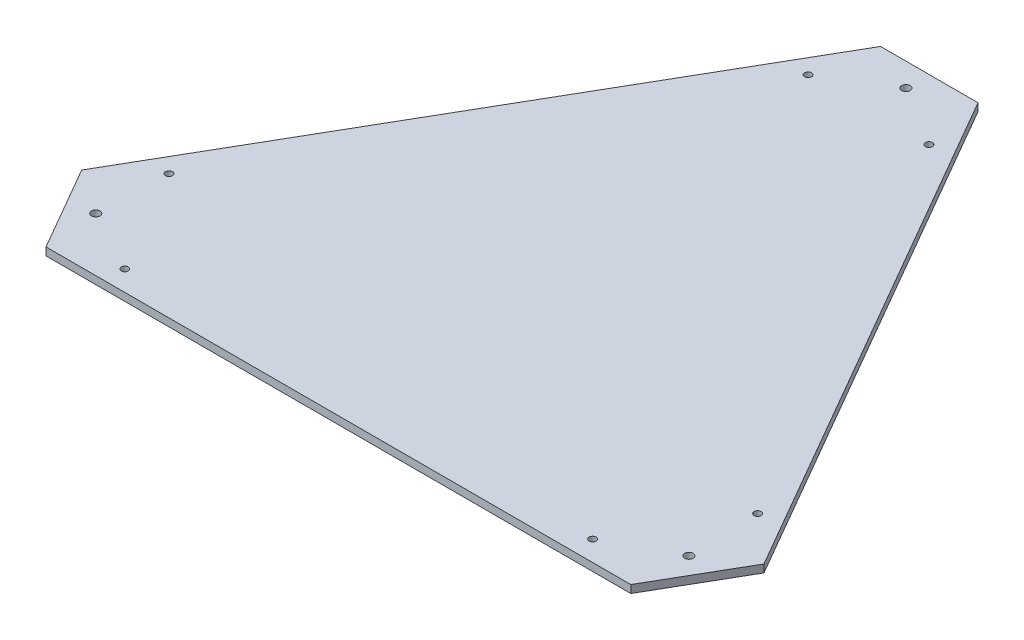
ISO-10303-21;
HEADER;
FILE_DESCRIPTION(('STEP AP214'),'2;1');
FILE_NAME('part.step','',(''),(''),'','','');
FILE_SCHEMA(('AUTOMOTIVE_DESIGN { 1 0 10303 214 1 1 1 1 }'));
ENDSEC;
DATA;
#1=APPLICATION_CONTEXT('core data for automotive mechanical design processes');
#2=APPLICATION_PROTOCOL_DEFINITION('international standard','automotive_design',2000,#1);
#3=PRODUCT_CONTEXT('',#1,'mechanical');
#4=PRODUCT('Part','Part','',(#3));
#5=PRODUCT_RELATED_PRODUCT_CATEGORY('part','',(#4));
#6=PRODUCT_DEFINITION_FORMATION('','',#4);
#7=PRODUCT_DEFINITION_CONTEXT('part definition',#1,'design');
#8=PRODUCT_DEFINITION('design','',#6,#7);
#9=PRODUCT_DEFINITION_SHAPE('','',#8);
#10=(LENGTH_UNIT() NAMED_UNIT(*) SI_UNIT(.MILLI.,.METRE.));
#11=(NAMED_UNIT(*) PLANE_ANGLE_UNIT() SI_UNIT($,.RADIAN.));
#12=(NAMED_UNIT(*) SI_UNIT($,.STERADIAN.) SOLID_ANGLE_UNIT());
#13=UNCERTAINTY_MEASURE_WITH_UNIT(LENGTH_MEASURE(1.E-05),#10,'distance_accuracy_value','');
#14=(GEOMETRIC_REPRESENTATION_CONTEXT(3) GLOBAL_UNCERTAINTY_ASSIGNED_CONTEXT((#13)) GLOBAL_UNIT_ASSIGNED_CONTEXT((#10,
#11,#12)) REPRESENTATION_CONTEXT('',''));
#15=CARTESIAN_POINT('',(0.,0.,0.));
#16=DIRECTION('',(0.,0.,1.));
#17=DIRECTION('',(1.,0.,0.));
#18=AXIS2_PLACEMENT_3D('',#15,#16,#17);
#19=CARTESIAN_POINT('',(-218.75,5.,90.210979560879));
#20=DIRECTION('',(0.866025403784439,0.,0.5));
#21=DIRECTION('',(0.5,0.,-0.866025403784439));
#22=AXIS2_PLACEMENT_3D('',#19,#20,#21);
#23=PLANE('',#22);
#24=DIRECTION('',(-0.499999999999999,0.,0.866025403784439));
#25=VECTOR('',#24,1.);
#26=CARTESIAN_POINT('',(-218.75,0.,90.210979560879));
#27=LINE('',#26,#25);
#28=CARTESIAN_POINT('',(-31.25,0.,-234.548546858286));
#29=VERTEX_POINT('',#28);
#30=CARTESIAN_POINT('',(-218.75,0.,90.210979560879));
#31=VERTEX_POINT('',#30);
#32=EDGE_CURVE('E119',#29,#31,#27,.T.);
#33=ORIENTED_EDGE('',*,*,#32,.T.);
#34=DIRECTION('',(0.,-1.,0.));
#35=VECTOR('',#34,1.);
#36=CARTESIAN_POINT('',(-218.75,5.,90.210979560879));
#37=LINE('',#36,#35);
#38=CARTESIAN_POINT('',(-218.75,5.,90.210979560879));
#39=VERTEX_POINT('',#38);
#40=EDGE_CURVE('E11',#39,#31,#37,.T.);
#41=ORIENTED_EDGE('',*,*,#40,.F.);
#42=DIRECTION('',(-0.499999999999999,0.,0.866025403784439));
#43=VECTOR('',#42,1.);
#44=CARTESIAN_POINT('',(-218.75,5.,90.210979560879));
#45=LINE('',#44,#43);
#46=CARTESIAN_POINT('',(-31.25,5.,-234.548546858286));
#47=VERTEX_POINT('',#46);
#48=EDGE_CURVE('E130',#47,#39,#45,.T.);
#49=ORIENTED_EDGE('',*,*,#48,.F.);
#50=DIRECTION('',(0.,-1.,0.));
#51=VECTOR('',#50,1.);
#52=CARTESIAN_POINT('',(-31.25,5.,-234.548546858286));
#53=LINE('',#52,#51);
#54=EDGE_CURVE('E115',#47,#29,#53,.T.);
#55=ORIENTED_EDGE('',*,*,#54,.T.);
#56=EDGE_LOOP('',(#33,#41,#49,#55));
#57=FACE_BOUND('',#56,.T.);
#58=ADVANCED_FACE('F35',(#57),#23,.F.);
#59=CARTESIAN_POINT('',(-187.5,5.,144.337567297407));
#60=DIRECTION('',(0.86602540378444,0.,-0.499999999999998));
#61=DIRECTION('',(-0.499999999999998,0.,-0.86602540378444));
#62=AXIS2_PLACEMENT_3D('',#59,#60,#61);
#63=PLANE('',#62);
#64=DIRECTION('',(0.499999999999998,0.,0.86602540378444));
#65=VECTOR('',#64,1.);
#66=CARTESIAN_POINT('',(-187.5,0.,144.337567297407));
#67=LINE('',#66,#65);
#68=CARTESIAN_POINT('',(-187.5,0.,144.337567297407));
#69=VERTEX_POINT('',#68);
#70=EDGE_CURVE('E122',#31,#69,#67,.T.);
#71=ORIENTED_EDGE('',*,*,#70,.T.);
#72=DIRECTION('',(0.,-1.,0.));
#73=VECTOR('',#72,1.);
#74=CARTESIAN_POINT('',(-187.5,5.,144.337567297407));
#75=LINE('',#74,#73);
#76=CARTESIAN_POINT('',(-187.5,5.,144.337567297407));
#77=VERTEX_POINT('',#76);
#78=EDGE_CURVE('E43',#77,#69,#75,.T.);
#79=ORIENTED_EDGE('',*,*,#78,.F.);
#80=DIRECTION('',(0.499999999999998,0.,0.86602540378444));
#81=VECTOR('',#80,1.);
#82=CARTESIAN_POINT('',(-187.5,5.,144.337567297407));
#83=LINE('',#82,#81);
#84=EDGE_CURVE('E88',#39,#77,#83,.T.);
#85=ORIENTED_EDGE('',*,*,#84,.F.);
#86=ORIENTED_EDGE('',*,*,#40,.T.);
#87=EDGE_LOOP('',(#71,#79,#85,#86));
#88=FACE_BOUND('',#87,.T.);
#89=ADVANCED_FACE('F156',(#88),#63,.F.);
#90=CARTESIAN_POINT('',(187.5,5.,144.337567297406));
#91=DIRECTION('',(0.,0.,-1.));
#92=DIRECTION('',(-1.,0.,0.));
#93=AXIS2_PLACEMENT_3D('',#90,#91,#92);
#94=PLANE('',#93);
#95=DIRECTION('',(1.,0.,0.));
#96=VECTOR('',#95,1.);
#97=CARTESIAN_POINT('',(187.5,0.,144.337567297406));
#98=LINE('',#97,#96);
#99=CARTESIAN_POINT('',(187.5,0.,144.337567297406));
#100=VERTEX_POINT('',#99);
#101=EDGE_CURVE('E125',#69,#100,#98,.T.);
#102=ORIENTED_EDGE('',*,*,#101,.T.);
#103=DIRECTION('',(0.,-1.,0.));
#104=VECTOR('',#103,1.);
#105=CARTESIAN_POINT('',(187.5,5.,144.337567297406));
#106=LINE('',#105,#104);
#107=CARTESIAN_POINT('',(187.5,5.,144.337567297406));
#108=VERTEX_POINT('',#107);
#109=EDGE_CURVE('E110',#108,#100,#106,.T.);
#110=ORIENTED_EDGE('',*,*,#109,.F.);
#111=DIRECTION('',(1.,0.,0.));
#112=VECTOR('',#111,1.);
#113=CARTESIAN_POINT('',(187.5,5.,144.337567297406));
#114=LINE('',#113,#112);
#115=EDGE_CURVE('E101',#77,#108,#114,.T.);
#116=ORIENTED_EDGE('',*,*,#115,.F.);
#117=ORIENTED_EDGE('',*,*,#78,.T.);
#118=EDGE_LOOP('',(#102,#110,#116,#117));
#119=FACE_BOUND('',#118,.T.);
#120=ADVANCED_FACE('F136',(#119),#94,.F.);
#121=CARTESIAN_POINT('',(218.75,5.,90.210979560879));
#122=DIRECTION('',(-0.86602540378444,0.,-0.499999999999998));
#123=DIRECTION('',(-0.499999999999998,0.,0.86602540378444));
#124=AXIS2_PLACEMENT_3D('',#121,#122,#123);
#125=PLANE('',#124);
#126=DIRECTION('',(0.499999999999998,0.,-0.86602540378444));
#127=VECTOR('',#126,1.);
#128=CARTESIAN_POINT('',(218.75,0.,90.210979560879));
#129=LINE('',#128,#127);
#130=CARTESIAN_POINT('',(218.75,0.,90.210979560879));
#131=VERTEX_POINT('',#130);
#132=EDGE_CURVE('E109',#100,#131,#129,.T.);
#133=ORIENTED_EDGE('',*,*,#132,.T.);
#134=DIRECTION('',(0.,-1.,0.));
#135=VECTOR('',#134,1.);
#136=CARTESIAN_POINT('',(218.75,5.,90.210979560879));
#137=LINE('',#136,#135);
#138=CARTESIAN_POINT('',(218.75,5.,90.210979560879));
#139=VERTEX_POINT('',#138);
#140=EDGE_CURVE('E106',#139,#131,#137,.T.);
#141=ORIENTED_EDGE('',*,*,#140,.F.);
#142=DIRECTION('',(0.499999999999998,0.,-0.86602540378444));
#143=VECTOR('',#142,1.);
#144=CARTESIAN_POINT('',(218.75,5.,90.210979560879));
#145=LINE('',#144,#143);
#146=EDGE_CURVE('E95',#108,#139,#145,.T.);
#147=ORIENTED_EDGE('',*,*,#146,.F.);
#148=ORIENTED_EDGE('',*,*,#109,.T.);
#149=EDGE_LOOP('',(#133,#141,#147,#148));
#150=FACE_BOUND('',#149,.T.);
#151=ADVANCED_FACE('F107',(#150),#125,.F.);
#152=CARTESIAN_POINT('',(31.25,5.,-234.548546858286));
#153=DIRECTION('',(-0.866025403784439,0.,0.5));
#154=DIRECTION('',(0.5,0.,0.866025403784439));
#155=AXIS2_PLACEMENT_3D('',#152,#153,#154);
#156=PLANE('',#155);
#157=DIRECTION('',(-0.499999999999999,0.,-0.866025403784439));
#158=VECTOR('',#157,1.);
#159=CARTESIAN_POINT('',(31.25,0.,-234.548546858286));
#160=LINE('',#159,#158);
#161=CARTESIAN_POINT('',(31.25,0.,-234.548546858286));
#162=VERTEX_POINT('',#161);
#163=EDGE_CURVE('E74',#131,#162,#160,.T.);
#164=ORIENTED_EDGE('',*,*,#163,.T.);
#165=DIRECTION('',(0.,-1.,0.));
#166=VECTOR('',#165,1.);
#167=CARTESIAN_POINT('',(31.25,5.,-234.548546858286));
#168=LINE('',#167,#166);
#169=CARTESIAN_POINT('',(31.25,5.,-234.548546858286));
#170=VERTEX_POINT('',#169);
#171=EDGE_CURVE('E111',#170,#162,#168,.T.);
#172=ORIENTED_EDGE('',*,*,#171,.F.);
#173=DIRECTION('',(-0.499999999999999,0.,-0.866025403784439));
#174=VECTOR('',#173,1.);
#175=CARTESIAN_POINT('',(31.25,5.,-234.548546858286));
#176=LINE('',#175,#174);
#177=EDGE_CURVE('E99',#139,#170,#176,.T.);
#178=ORIENTED_EDGE('',*,*,#177,.F.);
#179=ORIENTED_EDGE('',*,*,#140,.T.);
#180=EDGE_LOOP('',(#164,#172,#178,#179));
#181=FACE_BOUND('',#180,.T.);
#182=ADVANCED_FACE('F113',(#181),#156,.F.);
#183=CARTESIAN_POINT('',(-31.25,5.,-234.548546858286));
#184=DIRECTION('',(0.,0.,1.));
#185=DIRECTION('',(1.,0.,0.));
#186=AXIS2_PLACEMENT_3D('',#183,#184,#185);
#187=PLANE('',#186);
#188=DIRECTION('',(-1.,0.,0.));
#189=VECTOR('',#188,1.);
#190=CARTESIAN_POINT('',(-31.25,0.,-234.548546858286));
#191=LINE('',#190,#189);
#192=EDGE_CURVE('E80',#162,#29,#191,.T.);
#193=ORIENTED_EDGE('',*,*,#192,.T.);
#194=ORIENTED_EDGE('',*,*,#54,.F.);
#195=DIRECTION('',(-1.,0.,0.));
#196=VECTOR('',#195,1.);
#197=CARTESIAN_POINT('',(-31.25,5.,-234.548546858286));
#198=LINE('',#197,#196);
#199=EDGE_CURVE('E51',#170,#47,#198,.T.);
#200=ORIENTED_EDGE('',*,*,#199,.F.);
#201=ORIENTED_EDGE('',*,*,#171,.T.);
#202=EDGE_LOOP('',(#193,#194,#200,#201));
#203=FACE_BOUND('',#202,.T.);
#204=ADVANCED_FACE('F143',(#203),#187,.F.);
#205=CARTESIAN_POINT('',(0.,5.,0.));
#206=DIRECTION('',(0.,-1.,0.));
#207=DIRECTION('',(0.,0.,-1.));
#208=AXIS2_PLACEMENT_3D('',#205,#206,#207);
#209=PLANE('',#208);
#210=CARTESIAN_POINT('',(38.7416697508014,5.,-195.572594216369));
#211=DIRECTION('',(0.,1.,0.));
#212=DIRECTION('',(0.866025403784436,0.,-0.500000000000004));
#213=AXIS2_PLACEMENT_3D('',#210,#211,#212);
#214=CIRCLE('',#213,2.25000000000001);
#215=CARTESIAN_POINT('',(40.6902269093164,5.,-196.697594216369));
#216=VERTEX_POINT('',#215);
#217=EDGE_CURVE('E287',#216,#216,#214,.T.);
#218=ORIENTED_EDGE('',*,*,#217,.F.);
#219=EDGE_LOOP('',(#218));
#220=FACE_BOUND('',#219,.T.);
#221=CARTESIAN_POINT('',(-38.7416697508042,5.,-195.572594216369));
#222=DIRECTION('',(0.,1.,0.));
#223=DIRECTION('',(-0.866025403784443,0.,-0.499999999999992));
#224=AXIS2_PLACEMENT_3D('',#221,#222,#223);
#225=CIRCLE('',#224,2.25000000000001);
#226=CARTESIAN_POINT('',(-40.6902269093192,5.,-196.697594216369));
#227=VERTEX_POINT('',#226);
#228=EDGE_CURVE('E293',#227,#227,#225,.T.);
#229=ORIENTED_EDGE('',*,*,#228,.F.);
#230=EDGE_LOOP('',(#229));
#231=FACE_BOUND('',#230,.T.);
#232=CARTESIAN_POINT('',(-188.741669750802,5.,64.2350269189643));
#233=DIRECTION('',(0.,1.,0.));
#234=DIRECTION('',(-0.866025403784443,0.,-0.499999999999992));
#235=AXIS2_PLACEMENT_3D('',#232,#233,#234);
#236=CIRCLE('',#235,2.25000000000001);
#237=CARTESIAN_POINT('',(-190.690226909317,5.,63.1100269189643));
#238=VERTEX_POINT('',#237);
#239=EDGE_CURVE('E301',#238,#238,#236,.T.);
#240=ORIENTED_EDGE('',*,*,#239,.F.);
#241=EDGE_LOOP('',(#240));
#242=FACE_BOUND('',#241,.T.);
#243=CARTESIAN_POINT('',(188.741669750803,5.,64.2350269189617));
#244=DIRECTION('',(0.,1.,0.));
#245=DIRECTION('',(0.866025403784436,0.,-0.500000000000004));
#246=AXIS2_PLACEMENT_3D('',#243,#244,#245);
#247=CIRCLE('',#246,2.25000000000001);
#248=CARTESIAN_POINT('',(190.690226909318,5.,63.1100269189616));
#249=VERTEX_POINT('',#248);
#250=EDGE_CURVE('E291',#249,#249,#247,.T.);
#251=ORIENTED_EDGE('',*,*,#250,.F.);
#252=EDGE_LOOP('',(#251));
#253=FACE_BOUND('',#252,.T.);
#254=CARTESIAN_POINT('',(150.,5.,131.337567297406));
#255=DIRECTION('',(0.,1.,0.));
#256=DIRECTION('',(0.,0.,1.));
#257=AXIS2_PLACEMENT_3D('',#254,#255,#256);
#258=CIRCLE('',#257,2.25000000000001);
#259=CARTESIAN_POINT('',(150.,5.,133.587567297406));
#260=VERTEX_POINT('',#259);
#261=EDGE_CURVE('E310',#260,#260,#258,.T.);
#262=ORIENTED_EDGE('',*,*,#261,.F.);
#263=EDGE_LOOP('',(#262));
#264=FACE_BOUND('',#263,.T.);
#265=CARTESIAN_POINT('',(-150.,5.,131.337567297407));
#266=DIRECTION('',(0.,1.,0.));
#267=DIRECTION('',(0.,0.,1.));
#268=AXIS2_PLACEMENT_3D('',#265,#266,#267);
#269=CIRCLE('',#268,2.25000000000001);
#270=CARTESIAN_POINT('',(-150.,5.,133.587567297407));
#271=VERTEX_POINT('',#270);
#272=EDGE_CURVE('E316',#271,#271,#269,.T.);
#273=ORIENTED_EDGE('',*,*,#272,.F.);
#274=EDGE_LOOP('',(#273));
#275=FACE_BOUND('',#274,.T.);
#276=CARTESIAN_POINT('',(-190.134618943234,5.,109.774273429142));
#277=DIRECTION('',(0.,1.,0.));
#278=DIRECTION('',(0.,0.,1.));
#279=AXIS2_PLACEMENT_3D('',#276,#277,#278);
#280=CIRCLE('',#279,2.74999999999997);
#281=CARTESIAN_POINT('',(-190.134618943234,5.,112.524273429142));
#282=VERTEX_POINT('',#281);
#283=EDGE_CURVE('E322',#282,#282,#280,.T.);
#284=ORIENTED_EDGE('',*,*,#283,.F.);
#285=EDGE_LOOP('',(#284));
#286=FACE_BOUND('',#285,.T.);
#287=CARTESIAN_POINT('',(190.134618943231,5.,109.774273429142));
#288=DIRECTION('',(0.,1.,0.));
#289=DIRECTION('',(0.,0.,1.));
#290=AXIS2_PLACEMENT_3D('',#287,#288,#289);
#291=CIRCLE('',#290,2.75000000000017);
#292=CARTESIAN_POINT('',(190.134618943231,5.,112.524273429142));
#293=VERTEX_POINT('',#292);
#294=EDGE_CURVE('E329',#293,#293,#291,.T.);
#295=ORIENTED_EDGE('',*,*,#294,.F.);
#296=EDGE_LOOP('',(#295));
#297=FACE_BOUND('',#296,.T.);
#298=CARTESIAN_POINT('',(0.,5.,-219.548546858286));
#299=DIRECTION('',(0.,1.,0.));
#300=DIRECTION('',(0.,0.,1.));
#301=AXIS2_PLACEMENT_3D('',#298,#299,#300);
#302=CIRCLE('',#301,2.75);
#303=CARTESIAN_POINT('',(0.,5.,-216.798546858286));
#304=VERTEX_POINT('',#303);
#305=EDGE_CURVE('E123',#304,#304,#302,.T.);
#306=ORIENTED_EDGE('',*,*,#305,.F.);
#307=EDGE_LOOP('',(#306));
#308=FACE_BOUND('',#307,.T.);
#309=ORIENTED_EDGE('',*,*,#48,.T.);
#310=ORIENTED_EDGE('',*,*,#84,.T.);
#311=ORIENTED_EDGE('',*,*,#115,.T.);
#312=ORIENTED_EDGE('',*,*,#146,.T.);
#313=ORIENTED_EDGE('',*,*,#177,.T.);
#314=ORIENTED_EDGE('',*,*,#199,.T.);
#315=EDGE_LOOP('',(#309,#310,#311,#312,#313,#314));
#316=FACE_BOUND('',#315,.T.);
#317=ADVANCED_FACE('F97',(#220,#231,#242,#253,#264,#275,#286,#297,#308,#316),#209,.F.);
#318=CARTESIAN_POINT('',(0.,0.,0.));
#319=DIRECTION('',(0.,-1.,0.));
#320=DIRECTION('',(0.,0.,-1.));
#321=AXIS2_PLACEMENT_3D('',#318,#319,#320);
#322=PLANE('',#321);
#323=CARTESIAN_POINT('',(38.7416697508014,0.,-195.572594216369));
#324=DIRECTION('',(0.,-1.,0.));
#325=DIRECTION('',(0.,0.,-1.));
#326=AXIS2_PLACEMENT_3D('',#323,#324,#325);
#327=CIRCLE('',#326,2.25000000000001);
#328=CARTESIAN_POINT('',(38.7416697508014,0.,-197.822594216369));
#329=VERTEX_POINT('',#328);
#330=EDGE_CURVE('E284',#329,#329,#327,.F.);
#331=ORIENTED_EDGE('',*,*,#330,.T.);
#332=EDGE_LOOP('',(#331));
#333=FACE_BOUND('',#332,.T.);
#334=CARTESIAN_POINT('',(-38.7416697508042,0.,-195.572594216369));
#335=DIRECTION('',(0.,-1.,0.));
#336=DIRECTION('',(0.,0.,-1.));
#337=AXIS2_PLACEMENT_3D('',#334,#335,#336);
#338=CIRCLE('',#337,2.25000000000001);
#339=CARTESIAN_POINT('',(-38.7416697508042,0.,-197.822594216369));
#340=VERTEX_POINT('',#339);
#341=EDGE_CURVE('E298',#340,#340,#338,.F.);
#342=ORIENTED_EDGE('',*,*,#341,.T.);
#343=EDGE_LOOP('',(#342));
#344=FACE_BOUND('',#343,.T.);
#345=CARTESIAN_POINT('',(-188.741669750802,0.,64.2350269189643));
#346=DIRECTION('',(0.,-1.,0.));
#347=DIRECTION('',(0.,0.,-1.));
#348=AXIS2_PLACEMENT_3D('',#345,#346,#347);
#349=CIRCLE('',#348,2.25000000000001);
#350=CARTESIAN_POINT('',(-188.741669750802,0.,61.9850269189643));
#351=VERTEX_POINT('',#350);
#352=EDGE_CURVE('E304',#351,#351,#349,.F.);
#353=ORIENTED_EDGE('',*,*,#352,.T.);
#354=EDGE_LOOP('',(#353));
#355=FACE_BOUND('',#354,.T.);
#356=CARTESIAN_POINT('',(188.741669750803,0.,64.2350269189617));
#357=DIRECTION('',(0.,-1.,0.));
#358=DIRECTION('',(0.,0.,-1.));
#359=AXIS2_PLACEMENT_3D('',#356,#357,#358);
#360=CIRCLE('',#359,2.25000000000001);
#361=CARTESIAN_POINT('',(188.741669750803,0.,61.9850269189617));
#362=VERTEX_POINT('',#361);
#363=EDGE_CURVE('E288',#362,#362,#360,.F.);
#364=ORIENTED_EDGE('',*,*,#363,.T.);
#365=EDGE_LOOP('',(#364));
#366=FACE_BOUND('',#365,.T.);
#367=CARTESIAN_POINT('',(150.,0.,131.337567297406));
#368=DIRECTION('',(0.,-1.,0.));
#369=DIRECTION('',(0.,0.,-1.));
#370=AXIS2_PLACEMENT_3D('',#367,#368,#369);
#371=CIRCLE('',#370,2.25000000000001);
#372=CARTESIAN_POINT('',(150.,0.,129.087567297406));
#373=VERTEX_POINT('',#372);
#374=EDGE_CURVE('E308',#373,#373,#371,.F.);
#375=ORIENTED_EDGE('',*,*,#374,.T.);
#376=EDGE_LOOP('',(#375));
#377=FACE_BOUND('',#376,.T.);
#378=CARTESIAN_POINT('',(-150.,0.,131.337567297407));
#379=DIRECTION('',(0.,-1.,0.));
#380=DIRECTION('',(0.,0.,-1.));
#381=AXIS2_PLACEMENT_3D('',#378,#379,#380);
#382=CIRCLE('',#381,2.25000000000001);
#383=CARTESIAN_POINT('',(-150.,0.,129.087567297407));
#384=VERTEX_POINT('',#383);
#385=EDGE_CURVE('E313',#384,#384,#382,.F.);
#386=ORIENTED_EDGE('',*,*,#385,.T.);
#387=EDGE_LOOP('',(#386));
#388=FACE_BOUND('',#387,.T.);
#389=CARTESIAN_POINT('',(-190.134618943234,0.,109.774273429142));
#390=DIRECTION('',(0.,-1.,0.));
#391=DIRECTION('',(0.,0.,-1.));
#392=AXIS2_PLACEMENT_3D('',#389,#390,#391);
#393=CIRCLE('',#392,2.74999999999997);
#394=CARTESIAN_POINT('',(-190.134618943234,0.,107.024273429142));
#395=VERTEX_POINT('',#394);
#396=EDGE_CURVE('E326',#395,#395,#393,.F.);
#397=ORIENTED_EDGE('',*,*,#396,.T.);
#398=EDGE_LOOP('',(#397));
#399=FACE_BOUND('',#398,.T.);
#400=CARTESIAN_POINT('',(190.134618943231,0.,109.774273429142));
#401=DIRECTION('',(0.,-1.,0.));
#402=DIRECTION('',(0.,0.,-1.));
#403=AXIS2_PLACEMENT_3D('',#400,#401,#402);
#404=CIRCLE('',#403,2.75000000000017);
#405=CARTESIAN_POINT('',(190.134618943231,0.,107.024273429142));
#406=VERTEX_POINT('',#405);
#407=EDGE_CURVE('E319',#406,#406,#404,.F.);
#408=ORIENTED_EDGE('',*,*,#407,.T.);
#409=EDGE_LOOP('',(#408));
#410=FACE_BOUND('',#409,.T.);
#411=CARTESIAN_POINT('',(0.,0.,-219.548546858286));
#412=DIRECTION('',(0.,-1.,0.));
#413=DIRECTION('',(0.,0.,-1.));
#414=AXIS2_PLACEMENT_3D('',#411,#412,#413);
#415=CIRCLE('',#414,2.75);
#416=CARTESIAN_POINT('',(0.,0.,-222.298546858286));
#417=VERTEX_POINT('',#416);
#418=EDGE_CURVE('E325',#417,#417,#415,.F.);
#419=ORIENTED_EDGE('',*,*,#418,.T.);
#420=EDGE_LOOP('',(#419));
#421=FACE_BOUND('',#420,.T.);
#422=ORIENTED_EDGE('',*,*,#32,.F.);
#423=ORIENTED_EDGE('',*,*,#192,.F.);
#424=ORIENTED_EDGE('',*,*,#163,.F.);
#425=ORIENTED_EDGE('',*,*,#132,.F.);
#426=ORIENTED_EDGE('',*,*,#101,.F.);
#427=ORIENTED_EDGE('',*,*,#70,.F.);
#428=EDGE_LOOP('',(#422,#423,#424,#425,#426,#427));
#429=FACE_BOUND('',#428,.T.);
#430=ADVANCED_FACE('F139',(#333,#344,#355,#366,#377,#388,#399,#410,#421,#429),#322,.T.);
#431=CARTESIAN_POINT('',(0.,-0.00100000000000013,-219.548546858286));
#432=DIRECTION('',(0.,1.,0.));
#433=DIRECTION('',(0.,0.,1.));
#434=AXIS2_PLACEMENT_3D('',#431,#432,#433);
#435=CYLINDRICAL_SURFACE('',#434,2.75);
#436=ORIENTED_EDGE('',*,*,#418,.F.);
#437=EDGE_LOOP('',(#436));
#438=FACE_BOUND('',#437,.T.);
#439=ORIENTED_EDGE('',*,*,#305,.T.);
#440=EDGE_LOOP('',(#439));
#441=FACE_BOUND('',#440,.T.);
#442=ADVANCED_FACE('F184',(#438,#441),#435,.F.);
#443=CARTESIAN_POINT('',(190.134618943231,-0.00100000000000013,109.774273429142));
#444=DIRECTION('',(0.,1.,0.));
#445=DIRECTION('',(0.,0.,1.));
#446=AXIS2_PLACEMENT_3D('',#443,#444,#445);
#447=CYLINDRICAL_SURFACE('',#446,2.75000000000017);
#448=ORIENTED_EDGE('',*,*,#407,.F.);
#449=EDGE_LOOP('',(#448));
#450=FACE_BOUND('',#449,.T.);
#451=ORIENTED_EDGE('',*,*,#294,.T.);
#452=EDGE_LOOP('',(#451));
#453=FACE_BOUND('',#452,.T.);
#454=ADVANCED_FACE('F189',(#450,#453),#447,.F.);
#455=CARTESIAN_POINT('',(-190.134618943234,-0.00100000000000013,109.774273429142));
#456=DIRECTION('',(0.,1.,0.));
#457=DIRECTION('',(0.,0.,1.));
#458=AXIS2_PLACEMENT_3D('',#455,#456,#457);
#459=CYLINDRICAL_SURFACE('',#458,2.74999999999997);
#460=ORIENTED_EDGE('',*,*,#396,.F.);
#461=EDGE_LOOP('',(#460));
#462=FACE_BOUND('',#461,.T.);
#463=ORIENTED_EDGE('',*,*,#283,.T.);
#464=EDGE_LOOP('',(#463));
#465=FACE_BOUND('',#464,.T.);
#466=ADVANCED_FACE('F201',(#462,#465),#459,.F.);
#467=CARTESIAN_POINT('',(-150.,-0.00100000000000013,131.337567297407));
#468=DIRECTION('',(0.,1.,0.));
#469=DIRECTION('',(0.,0.,1.));
#470=AXIS2_PLACEMENT_3D('',#467,#468,#469);
#471=CYLINDRICAL_SURFACE('',#470,2.25000000000001);
#472=ORIENTED_EDGE('',*,*,#385,.F.);
#473=EDGE_LOOP('',(#472));
#474=FACE_BOUND('',#473,.T.);
#475=ORIENTED_EDGE('',*,*,#272,.T.);
#476=EDGE_LOOP('',(#475));
#477=FACE_BOUND('',#476,.T.);
#478=ADVANCED_FACE('F211',(#474,#477),#471,.F.);
#479=CARTESIAN_POINT('',(150.,-0.00100000000000013,131.337567297406));
#480=DIRECTION('',(0.,1.,0.));
#481=DIRECTION('',(0.,0.,1.));
#482=AXIS2_PLACEMENT_3D('',#479,#480,#481);
#483=CYLINDRICAL_SURFACE('',#482,2.25000000000001);
#484=ORIENTED_EDGE('',*,*,#374,.F.);
#485=EDGE_LOOP('',(#484));
#486=FACE_BOUND('',#485,.T.);
#487=ORIENTED_EDGE('',*,*,#261,.T.);
#488=EDGE_LOOP('',(#487));
#489=FACE_BOUND('',#488,.T.);
#490=ADVANCED_FACE('F221',(#486,#489),#483,.F.);
#491=CARTESIAN_POINT('',(188.741669750803,-0.00100000000000013,64.2350269189617));
#492=DIRECTION('',(0.,1.,0.));
#493=DIRECTION('',(0.,0.,1.));
#494=AXIS2_PLACEMENT_3D('',#491,#492,#493);
#495=CYLINDRICAL_SURFACE('',#494,2.25000000000001);
#496=ORIENTED_EDGE('',*,*,#363,.F.);
#497=EDGE_LOOP('',(#496));
#498=FACE_BOUND('',#497,.T.);
#499=ORIENTED_EDGE('',*,*,#250,.T.);
#500=EDGE_LOOP('',(#499));
#501=FACE_BOUND('',#500,.T.);
#502=ADVANCED_FACE('F230',(#498,#501),#495,.F.);
#503=CARTESIAN_POINT('',(-188.741669750802,-0.00100000000000013,64.2350269189643));
#504=DIRECTION('',(0.,1.,0.));
#505=DIRECTION('',(0.,0.,1.));
#506=AXIS2_PLACEMENT_3D('',#503,#504,#505);
#507=CYLINDRICAL_SURFACE('',#506,2.25000000000001);
#508=ORIENTED_EDGE('',*,*,#352,.F.);
#509=EDGE_LOOP('',(#508));
#510=FACE_BOUND('',#509,.T.);
#511=ORIENTED_EDGE('',*,*,#239,.T.);
#512=EDGE_LOOP('',(#511));
#513=FACE_BOUND('',#512,.T.);
#514=ADVANCED_FACE('F247',(#510,#513),#507,.F.);
#515=CARTESIAN_POINT('',(-38.7416697508042,-0.00100000000000013,-195.572594216369));
#516=DIRECTION('',(0.,1.,0.));
#517=DIRECTION('',(0.,0.,1.));
#518=AXIS2_PLACEMENT_3D('',#515,#516,#517);
#519=CYLINDRICAL_SURFACE('',#518,2.25000000000001);
#520=ORIENTED_EDGE('',*,*,#341,.F.);
#521=EDGE_LOOP('',(#520));
#522=FACE_BOUND('',#521,.T.);
#523=ORIENTED_EDGE('',*,*,#228,.T.);
#524=EDGE_LOOP('',(#523));
#525=FACE_BOUND('',#524,.T.);
#526=ADVANCED_FACE('F257',(#522,#525),#519,.F.);
#527=CARTESIAN_POINT('',(38.7416697508014,-0.00100000000000013,-195.572594216369));
#528=DIRECTION('',(0.,1.,0.));
#529=DIRECTION('',(0.,0.,1.));
#530=AXIS2_PLACEMENT_3D('',#527,#528,#529);
#531=CYLINDRICAL_SURFACE('',#530,2.25000000000001);
#532=ORIENTED_EDGE('',*,*,#330,.F.);
#533=EDGE_LOOP('',(#532));
#534=FACE_BOUND('',#533,.T.);
#535=ORIENTED_EDGE('',*,*,#217,.T.);
#536=EDGE_LOOP('',(#535));
#537=FACE_BOUND('',#536,.T.);
#538=ADVANCED_FACE('F267',(#534,#537),#531,.F.);
#539=CLOSED_SHELL('',(#58,#89,#120,#151,#182,#204,#317,#430,#442,#454,#466,#478,#490,#502,#514,
#526,#538));
#540=MANIFOLD_SOLID_BREP('B2',#539);
#541=ADVANCED_BREP_SHAPE_REPRESENTATION('',(#18,#540),#14);
#542=SHAPE_DEFINITION_REPRESENTATION(#9,#541);
ENDSEC;
END-ISO-10303-21;
